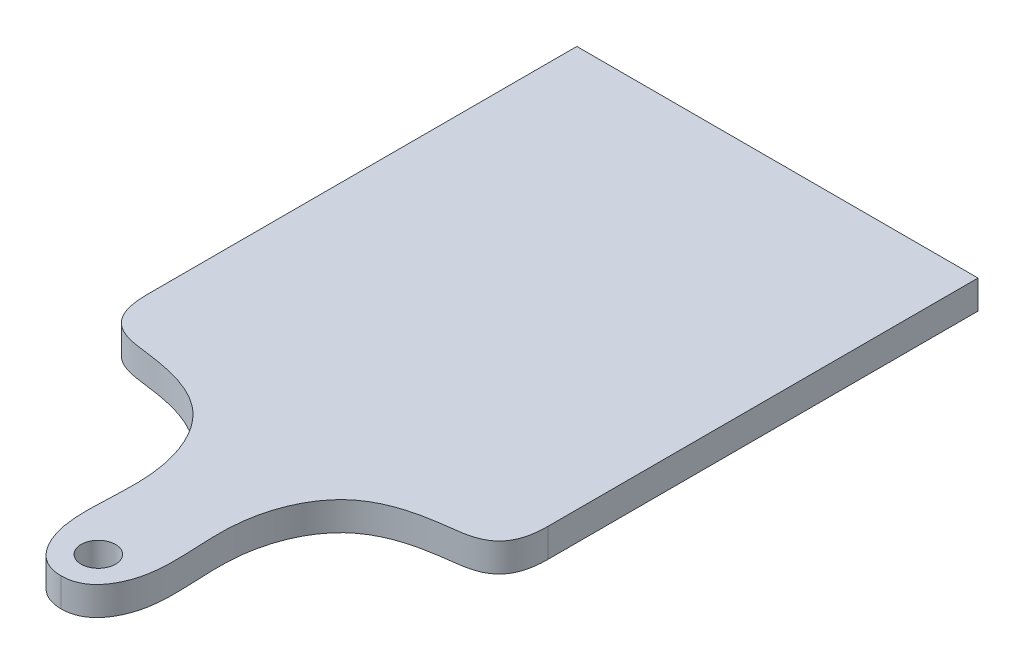
ISO-10303-21;
HEADER;
FILE_DESCRIPTION(('STEP AP214'),'2;1');
FILE_NAME('part.step','',(''),(''),'','','');
FILE_SCHEMA(('AUTOMOTIVE_DESIGN { 1 0 10303 214 1 1 1 1 }'));
ENDSEC;
DATA;
#1=APPLICATION_CONTEXT('core data for automotive mechanical design processes');
#2=APPLICATION_PROTOCOL_DEFINITION('international standard','automotive_design',2000,#1);
#3=PRODUCT_CONTEXT('',#1,'mechanical');
#4=PRODUCT('Part','Part','',(#3));
#5=PRODUCT_RELATED_PRODUCT_CATEGORY('part','',(#4));
#6=PRODUCT_DEFINITION_FORMATION('','',#4);
#7=PRODUCT_DEFINITION_CONTEXT('part definition',#1,'design');
#8=PRODUCT_DEFINITION('design','',#6,#7);
#9=PRODUCT_DEFINITION_SHAPE('','',#8);
#10=(LENGTH_UNIT() NAMED_UNIT(*) SI_UNIT(.MILLI.,.METRE.));
#11=(NAMED_UNIT(*) PLANE_ANGLE_UNIT() SI_UNIT($,.RADIAN.));
#12=(NAMED_UNIT(*) SI_UNIT($,.STERADIAN.) SOLID_ANGLE_UNIT());
#13=UNCERTAINTY_MEASURE_WITH_UNIT(LENGTH_MEASURE(1.E-05),#10,'distance_accuracy_value','');
#14=(GEOMETRIC_REPRESENTATION_CONTEXT(3) GLOBAL_UNCERTAINTY_ASSIGNED_CONTEXT((#13)) GLOBAL_UNIT_ASSIGNED_CONTEXT((#10,
#11,#12)) REPRESENTATION_CONTEXT('',''));
#15=CARTESIAN_POINT('',(0.,0.,0.));
#16=DIRECTION('',(0.,0.,1.));
#17=DIRECTION('',(1.,0.,0.));
#18=AXIS2_PLACEMENT_3D('',#15,#16,#17);
#19=CARTESIAN_POINT('',(-18.4701496914723,10.,89.4166829594998));
#20=DIRECTION('',(0.,-1.,0.));
#21=DIRECTION('',(0.,0.,-1.));
#22=AXIS2_PLACEMENT_3D('',#19,#20,#21);
#23=PLANE('',#22);
#24=DIRECTION('',(0.,0.,1.));
#25=VECTOR('',#24,1.);
#26=CARTESIAN_POINT('',(-70.,10.,-100.));
#27=LINE('',#26,#25);
#28=CARTESIAN_POINT('',(-70.,10.,-100.));
#29=VERTEX_POINT('',#28);
#30=CARTESIAN_POINT('',(-70.,10.,50.));
#31=VERTEX_POINT('',#30);
#32=EDGE_CURVE('E132',#29,#31,#27,.T.);
#33=ORIENTED_EDGE('',*,*,#32,.T.);
#34=CARTESIAN_POINT('',(-70.,10.,50.));
#35=CARTESIAN_POINT('',(-70.,10.,66.8366283722981));
#36=CARTESIAN_POINT('',(-50.0967838440968,10.,66.5067685533697));
#37=CARTESIAN_POINT('',(-23.1664490858824,10.,74.7071276226545));
#38=CARTESIAN_POINT('',(-10.7874611561391,10.,106.896749483999));
#39=CARTESIAN_POINT('',(-19.2784098265602,10.,136.081374597632));
#40=CARTESIAN_POINT('',(-6.2284312116557,10.,150.));
#41=CARTESIAN_POINT('',(0.,10.,150.));
#42=B_SPLINE_CURVE_WITH_KNOTS('',3,(#34,#35,#36,#37,#38,#39,#40,#41),.UNSPECIFIED.,.F.,.F.,(4,1,
1,1,1,4),(0.,0.201262298275926,0.386001074396603,0.607005141737115,0.892124005589495,1.),.UNSPECIFIED.);
#43=CARTESIAN_POINT('',(0.,10.,150.));
#44=VERTEX_POINT('',#43);
#45=EDGE_CURVE('E86',#31,#44,#42,.T.);
#46=ORIENTED_EDGE('',*,*,#45,.T.);
#47=CARTESIAN_POINT('',(0.,10.,150.));
#48=CARTESIAN_POINT('',(6.22843121165568,10.,150.));
#49=CARTESIAN_POINT('',(19.2784098265602,10.,136.081374597632));
#50=CARTESIAN_POINT('',(10.7874611561391,10.,106.896749483999));
#51=CARTESIAN_POINT('',(23.1664490858824,10.,74.7071276226545));
#52=CARTESIAN_POINT('',(50.0967838440968,10.,66.5067685533697));
#53=CARTESIAN_POINT('',(70.,10.,66.8366283722981));
#54=CARTESIAN_POINT('',(70.,10.,50.));
#55=B_SPLINE_CURVE_WITH_KNOTS('',3,(#47,#48,#49,#50,#51,#52,#53,#54),.UNSPECIFIED.,.F.,.F.,(4,1,
1,1,1,4),(0.,0.107875994410505,0.392994858262885,0.613998925603397,0.798737701724074,1.),.UNSPECIFIED.);
#56=CARTESIAN_POINT('',(70.,10.,50.));
#57=VERTEX_POINT('',#56);
#58=EDGE_CURVE('E90',#44,#57,#55,.T.);
#59=ORIENTED_EDGE('',*,*,#58,.T.);
#60=DIRECTION('',(0.,0.,-1.));
#61=VECTOR('',#60,1.);
#62=CARTESIAN_POINT('',(70.,10.,-100.));
#63=LINE('',#62,#61);
#64=CARTESIAN_POINT('',(70.,10.,-100.));
#65=VERTEX_POINT('',#64);
#66=EDGE_CURVE('E94',#57,#65,#63,.T.);
#67=ORIENTED_EDGE('',*,*,#66,.T.);
#68=DIRECTION('',(-1.,0.,0.));
#69=VECTOR('',#68,1.);
#70=CARTESIAN_POINT('',(-70.,10.,-100.));
#71=LINE('',#70,#69);
#72=EDGE_CURVE('E52',#65,#29,#71,.T.);
#73=ORIENTED_EDGE('',*,*,#72,.T.);
#74=EDGE_LOOP('',(#33,#46,#59,#67,#73));
#75=FACE_BOUND('',#74,.T.);
#76=CARTESIAN_POINT('',(0.,10.,137.));
#77=DIRECTION('',(0.,1.,0.));
#78=DIRECTION('',(0.,0.,1.));
#79=AXIS2_PLACEMENT_3D('',#76,#77,#78);
#80=CIRCLE('',#79,6.00000000000001);
#81=CARTESIAN_POINT('',(0.,10.,143.));
#82=VERTEX_POINT('',#81);
#83=EDGE_CURVE('E117',#82,#82,#80,.T.);
#84=ORIENTED_EDGE('',*,*,#83,.F.);
#85=EDGE_LOOP('',(#84));
#86=FACE_BOUND('',#85,.T.);
#87=ADVANCED_FACE('F35',(#75,#86),#23,.F.);
#88=CARTESIAN_POINT('',(-18.4701496914723,0.,89.4166829594998));
#89=DIRECTION('',(0.,-1.,0.));
#90=DIRECTION('',(0.,0.,-1.));
#91=AXIS2_PLACEMENT_3D('',#88,#89,#90);
#92=PLANE('',#91);
#93=DIRECTION('',(0.,0.,1.));
#94=VECTOR('',#93,1.);
#95=CARTESIAN_POINT('',(-70.,0.,-100.));
#96=LINE('',#95,#94);
#97=CARTESIAN_POINT('',(-70.,0.,-100.));
#98=VERTEX_POINT('',#97);
#99=CARTESIAN_POINT('',(-70.,0.,50.));
#100=VERTEX_POINT('',#99);
#101=EDGE_CURVE('E113',#98,#100,#96,.T.);
#102=ORIENTED_EDGE('',*,*,#101,.F.);
#103=DIRECTION('',(-1.,0.,0.));
#104=VECTOR('',#103,1.);
#105=CARTESIAN_POINT('',(-70.,0.,-100.));
#106=LINE('',#105,#104);
#107=CARTESIAN_POINT('',(70.,0.,-100.));
#108=VERTEX_POINT('',#107);
#109=EDGE_CURVE('E78',#108,#98,#106,.T.);
#110=ORIENTED_EDGE('',*,*,#109,.F.);
#111=DIRECTION('',(0.,0.,-1.));
#112=VECTOR('',#111,1.);
#113=CARTESIAN_POINT('',(70.,0.,-100.));
#114=LINE('',#113,#112);
#115=CARTESIAN_POINT('',(70.,0.,50.));
#116=VERTEX_POINT('',#115);
#117=EDGE_CURVE('E72',#116,#108,#114,.T.);
#118=ORIENTED_EDGE('',*,*,#117,.F.);
#119=CARTESIAN_POINT('',(0.,0.,150.));
#120=CARTESIAN_POINT('',(6.22843121165568,0.,150.));
#121=CARTESIAN_POINT('',(19.2784098265602,0.,136.081374597632));
#122=CARTESIAN_POINT('',(10.7874611561391,0.,106.896749483999));
#123=CARTESIAN_POINT('',(23.1664490858824,0.,74.7071276226545));
#124=CARTESIAN_POINT('',(50.0967838440968,0.,66.5067685533697));
#125=CARTESIAN_POINT('',(70.,0.,66.8366283722981));
#126=CARTESIAN_POINT('',(70.,0.,50.));
#127=B_SPLINE_CURVE_WITH_KNOTS('',3,(#119,#120,#121,#122,#123,#124,#125,#126),.UNSPECIFIED.,.F.,
.F.,(4,1,1,1,1,4),(0.,0.107875994410505,0.392994858262885,0.613998925603397,0.798737701724074,
1.),.UNSPECIFIED.);
#128=CARTESIAN_POINT('',(0.,0.,150.));
#129=VERTEX_POINT('',#128);
#130=EDGE_CURVE('E101',#129,#116,#127,.T.);
#131=ORIENTED_EDGE('',*,*,#130,.F.);
#132=CARTESIAN_POINT('',(-70.,0.,50.));
#133=CARTESIAN_POINT('',(-70.,0.,66.8366283722981));
#134=CARTESIAN_POINT('',(-50.0967838440968,0.,66.5067685533697));
#135=CARTESIAN_POINT('',(-23.1664490858824,0.,74.7071276226545));
#136=CARTESIAN_POINT('',(-10.7874611561391,0.,106.896749483999));
#137=CARTESIAN_POINT('',(-19.2784098265602,0.,136.081374597632));
#138=CARTESIAN_POINT('',(-6.2284312116557,0.,150.));
#139=CARTESIAN_POINT('',(0.,0.,150.));
#140=B_SPLINE_CURVE_WITH_KNOTS('',3,(#132,#133,#134,#135,#136,#137,#138,#139),.UNSPECIFIED.,.F.,
.F.,(4,1,1,1,1,4),(0.,0.201262298275926,0.386001074396603,0.607005141737115,0.892124005589495,
1.),.UNSPECIFIED.);
#141=EDGE_CURVE('E116',#100,#129,#140,.T.);
#142=ORIENTED_EDGE('',*,*,#141,.F.);
#143=EDGE_LOOP('',(#102,#110,#118,#131,#142));
#144=FACE_BOUND('',#143,.T.);
#145=CARTESIAN_POINT('',(0.,0.,137.));
#146=DIRECTION('',(0.,1.,0.));
#147=DIRECTION('',(0.,0.,1.));
#148=AXIS2_PLACEMENT_3D('',#145,#146,#147);
#149=CIRCLE('',#148,6.00000000000001);
#150=CARTESIAN_POINT('',(0.,0.,143.));
#151=VERTEX_POINT('',#150);
#152=EDGE_CURVE('E177',#151,#151,#149,.T.);
#153=ORIENTED_EDGE('',*,*,#152,.T.);
#154=EDGE_LOOP('',(#153));
#155=FACE_BOUND('',#154,.T.);
#156=ADVANCED_FACE('F136',(#144,#155),#92,.T.);
#157=CARTESIAN_POINT('',(-70.,10.,-100.));
#158=DIRECTION('',(1.,0.,0.));
#159=DIRECTION('',(0.,0.,-1.));
#160=AXIS2_PLACEMENT_3D('',#157,#158,#159);
#161=PLANE('',#160);
#162=ORIENTED_EDGE('',*,*,#101,.T.);
#163=DIRECTION('',(0.,-1.,0.));
#164=VECTOR('',#163,1.);
#165=CARTESIAN_POINT('',(-70.,10.,50.));
#166=LINE('',#165,#164);
#167=EDGE_CURVE('E11',#31,#100,#166,.T.);
#168=ORIENTED_EDGE('',*,*,#167,.F.);
#169=ORIENTED_EDGE('',*,*,#32,.F.);
#170=DIRECTION('',(0.,-1.,0.));
#171=VECTOR('',#170,1.);
#172=CARTESIAN_POINT('',(-70.,10.,-100.));
#173=LINE('',#172,#171);
#174=EDGE_CURVE('E106',#29,#98,#173,.T.);
#175=ORIENTED_EDGE('',*,*,#174,.T.);
#176=EDGE_LOOP('',(#162,#168,#169,#175));
#177=FACE_BOUND('',#176,.T.);
#178=ADVANCED_FACE('F37',(#177),#161,.F.);
#179=DIRECTION('',(0.,-1.,0.));
#180=VECTOR('',#179,1.);
#181=SURFACE_OF_LINEAR_EXTRUSION('',#42,#180);
#182=ORIENTED_EDGE('',*,*,#141,.T.);
#183=DIRECTION('',(0.,-1.,0.));
#184=VECTOR('',#183,1.);
#185=CARTESIAN_POINT('',(0.,10.,150.));
#186=LINE('',#185,#184);
#187=EDGE_CURVE('E44',#44,#129,#186,.T.);
#188=ORIENTED_EDGE('',*,*,#187,.F.);
#189=ORIENTED_EDGE('',*,*,#45,.F.);
#190=ORIENTED_EDGE('',*,*,#167,.T.);
#191=EDGE_LOOP('',(#182,#188,#189,#190));
#192=FACE_BOUND('',#191,.T.);
#193=ADVANCED_FACE('F161',(#192),#181,.F.);
#194=DIRECTION('',(0.,-1.,0.));
#195=VECTOR('',#194,1.);
#196=SURFACE_OF_LINEAR_EXTRUSION('',#55,#195);
#197=ORIENTED_EDGE('',*,*,#130,.T.);
#198=DIRECTION('',(0.,-1.,0.));
#199=VECTOR('',#198,1.);
#200=CARTESIAN_POINT('',(70.,10.,50.));
#201=LINE('',#200,#199);
#202=EDGE_CURVE('E98',#57,#116,#201,.T.);
#203=ORIENTED_EDGE('',*,*,#202,.F.);
#204=ORIENTED_EDGE('',*,*,#58,.F.);
#205=ORIENTED_EDGE('',*,*,#187,.T.);
#206=EDGE_LOOP('',(#197,#203,#204,#205));
#207=FACE_BOUND('',#206,.T.);
#208=ADVANCED_FACE('F99',(#207),#196,.F.);
#209=CARTESIAN_POINT('',(70.,10.,-100.));
#210=DIRECTION('',(-1.,0.,0.));
#211=DIRECTION('',(0.,0.,1.));
#212=AXIS2_PLACEMENT_3D('',#209,#210,#211);
#213=PLANE('',#212);
#214=ORIENTED_EDGE('',*,*,#117,.T.);
#215=DIRECTION('',(0.,-1.,0.));
#216=VECTOR('',#215,1.);
#217=CARTESIAN_POINT('',(70.,10.,-100.));
#218=LINE('',#217,#216);
#219=EDGE_CURVE('E102',#65,#108,#218,.T.);
#220=ORIENTED_EDGE('',*,*,#219,.F.);
#221=ORIENTED_EDGE('',*,*,#66,.F.);
#222=ORIENTED_EDGE('',*,*,#202,.T.);
#223=EDGE_LOOP('',(#214,#220,#221,#222));
#224=FACE_BOUND('',#223,.T.);
#225=ADVANCED_FACE('F104',(#224),#213,.F.);
#226=CARTESIAN_POINT('',(-70.,10.,-100.));
#227=DIRECTION('',(0.,0.,1.));
#228=DIRECTION('',(1.,0.,0.));
#229=AXIS2_PLACEMENT_3D('',#226,#227,#228);
#230=PLANE('',#229);
#231=ORIENTED_EDGE('',*,*,#109,.T.);
#232=ORIENTED_EDGE('',*,*,#174,.F.);
#233=ORIENTED_EDGE('',*,*,#72,.F.);
#234=ORIENTED_EDGE('',*,*,#219,.T.);
#235=EDGE_LOOP('',(#231,#232,#233,#234));
#236=FACE_BOUND('',#235,.T.);
#237=ADVANCED_FACE('F141',(#236),#230,.F.);
#238=CARTESIAN_POINT('',(0.,10.,137.));
#239=DIRECTION('',(0.,-1.,0.));
#240=DIRECTION('',(0.,0.,-1.));
#241=AXIS2_PLACEMENT_3D('',#238,#239,#240);
#242=CYLINDRICAL_SURFACE('',#241,6.00000000000001);
#243=ORIENTED_EDGE('',*,*,#83,.T.);
#244=EDGE_LOOP('',(#243));
#245=FACE_BOUND('',#244,.T.);
#246=ORIENTED_EDGE('',*,*,#152,.F.);
#247=EDGE_LOOP('',(#246));
#248=FACE_BOUND('',#247,.T.);
#249=ADVANCED_FACE('F143',(#245,#248),#242,.F.);
#250=CLOSED_SHELL('',(#87,#156,#178,#193,#208,#225,#237,#249));
#251=MANIFOLD_SOLID_BREP('B2',#250);
#252=ADVANCED_BREP_SHAPE_REPRESENTATION('',(#18,#251),#14);
#253=SHAPE_DEFINITION_REPRESENTATION(#9,#252);
ENDSEC;
END-ISO-10303-21;
